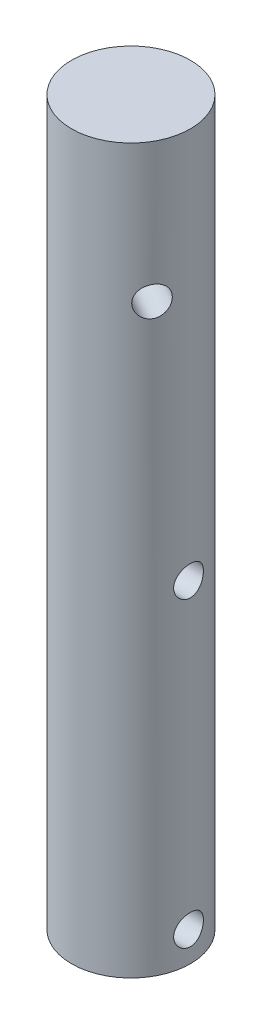
ISO-10303-21;
HEADER;
FILE_DESCRIPTION(('STEP AP214'),'2;1');
FILE_NAME('part.step','',(''),(''),'','','');
FILE_SCHEMA(('AUTOMOTIVE_DESIGN { 1 0 10303 214 1 1 1 1 }'));
ENDSEC;
DATA;
#1=APPLICATION_CONTEXT('core data for automotive mechanical design processes');
#2=APPLICATION_PROTOCOL_DEFINITION('international standard','automotive_design',2000,#1);
#3=PRODUCT_CONTEXT('',#1,'mechanical');
#4=PRODUCT('Part','Part','',(#3));
#5=PRODUCT_RELATED_PRODUCT_CATEGORY('part','',(#4));
#6=PRODUCT_DEFINITION_FORMATION('','',#4);
#7=PRODUCT_DEFINITION_CONTEXT('part definition',#1,'design');
#8=PRODUCT_DEFINITION('design','',#6,#7);
#9=PRODUCT_DEFINITION_SHAPE('','',#8);
#10=(LENGTH_UNIT() NAMED_UNIT(*) SI_UNIT(.MILLI.,.METRE.));
#11=(NAMED_UNIT(*) PLANE_ANGLE_UNIT() SI_UNIT($,.RADIAN.));
#12=(NAMED_UNIT(*) SI_UNIT($,.STERADIAN.) SOLID_ANGLE_UNIT());
#13=UNCERTAINTY_MEASURE_WITH_UNIT(LENGTH_MEASURE(1.E-05),#10,'distance_accuracy_value','');
#14=(GEOMETRIC_REPRESENTATION_CONTEXT(3) GLOBAL_UNCERTAINTY_ASSIGNED_CONTEXT((#13)) GLOBAL_UNIT_ASSIGNED_CONTEXT((#10,
#11,#12)) REPRESENTATION_CONTEXT('',''));
#15=CARTESIAN_POINT('',(0.,0.,0.));
#16=DIRECTION('',(0.,0.,1.));
#17=DIRECTION('',(1.,0.,0.));
#18=AXIS2_PLACEMENT_3D('',#15,#16,#17);
#19=CARTESIAN_POINT('',(-19.0091828831705,210.,-53.2448828787845));
#20=DIRECTION('',(0.,1.,0.));
#21=DIRECTION('',(0.,0.,-1.));
#22=AXIS2_PLACEMENT_3D('',#19,#20,#21);
#23=CYLINDRICAL_SURFACE('',#22,6.);
#24=CARTESIAN_POINT('',(-19.0091828831705,210.,-53.2448828787845));
#25=DIRECTION('',(0.,1.,0.));
#26=DIRECTION('',(0.,0.,1.));
#27=AXIS2_PLACEMENT_3D('',#24,#25,#26);
#28=CIRCLE('',#27,6.);
#29=CARTESIAN_POINT('',(-19.0091828831705,210.,-47.2448828787845));
#30=VERTEX_POINT('',#29);
#31=EDGE_CURVE('E10',#30,#30,#28,.T.);
#32=ORIENTED_EDGE('',*,*,#31,.T.);
#33=EDGE_LOOP('',(#32));
#34=FACE_BOUND('',#33,.T.);
#35=CARTESIAN_POINT('',(-19.0091828831705,283.,-53.2448828787845));
#36=DIRECTION('',(0.,1.,0.));
#37=DIRECTION('',(0.,0.,1.));
#38=AXIS2_PLACEMENT_3D('',#35,#36,#37);
#39=CIRCLE('',#38,6.);
#40=CARTESIAN_POINT('',(-19.0091828831705,283.,-47.2448828787845));
#41=VERTEX_POINT('',#40);
#42=EDGE_CURVE('E51',#41,#41,#39,.T.);
#43=ORIENTED_EDGE('',*,*,#42,.F.);
#44=EDGE_LOOP('',(#43));
#45=FACE_BOUND('',#44,.T.);
#46=CARTESIAN_POINT('',(-24.8186579024817,213.,-51.7448828787845));
#47=CARTESIAN_POINT('',(-24.8186594836824,212.917169549445,-51.7448852316294));
#48=CARTESIAN_POINT('',(-24.820448719254,212.834313060793,-51.7517671314861));
#49=CARTESIAN_POINT('',(-24.82739405513,212.670979453096,-51.779069003506));
#50=CARTESIAN_POINT('',(-24.8325521149014,212.590503747319,-51.7994968547392));
#51=CARTESIAN_POINT('',(-24.8456152307463,212.434317877088,-51.8531881590053));
#52=CARTESIAN_POINT('',(-24.853516739313,212.358601706769,-51.8864350420718));
#53=CARTESIAN_POINT('',(-24.8711720353434,212.213813488476,-51.9647701940276));
#54=CARTESIAN_POINT('',(-24.8809259014415,212.144741722752,-52.0098589656481));
#55=CARTESIAN_POINT('',(-24.9014271813042,212.013683012843,-52.1116578223974));
#56=CARTESIAN_POINT('',(-24.9121904689087,211.95186383979,-52.1685807461621));
#57=CARTESIAN_POINT('',(-24.9333601362623,211.838543163384,-52.2919736403241));
#58=CARTESIAN_POINT('',(-24.9437664825689,211.787042624627,-52.3584445022763));
#59=CARTESIAN_POINT('',(-24.963225376294,211.695134719421,-52.5001957581371));
#60=CARTESIAN_POINT('',(-24.9722570075741,211.654892167103,-52.5755861330674));
#61=CARTESIAN_POINT('',(-24.9877677547264,211.587714213508,-52.7323249682088));
#62=CARTESIAN_POINT('',(-24.9942472471766,211.560776848851,-52.8136725473093));
#63=CARTESIAN_POINT('',(-25.0038114362596,211.521511299253,-52.978267623532));
#64=CARTESIAN_POINT('',(-25.0069622462364,211.508898213404,-53.0614432470551));
#65=CARTESIAN_POINT('',(-25.0097444478143,211.497744972435,-53.2287855872268));
#66=CARTESIAN_POINT('',(-25.0093763597508,211.499202736674,-53.3129521555073));
#67=CARTESIAN_POINT('',(-25.0052114528917,211.51594491015,-53.4779112495431));
#68=CARTESIAN_POINT('',(-25.0014908972158,211.530921795032,-53.5587372021861));
#69=CARTESIAN_POINT('',(-24.9911279023197,211.573782762029,-53.716690249905));
#70=CARTESIAN_POINT('',(-24.9844853075612,211.601667531226,-53.7938171478401));
#71=CARTESIAN_POINT('',(-24.9689079413759,211.669801542412,-53.9429929340372));
#72=CARTESIAN_POINT('',(-24.9599530013409,211.710160226797,-54.0149896434342));
#73=CARTESIAN_POINT('',(-24.9407223060284,211.80201340747,-54.1512963122952));
#74=CARTESIAN_POINT('',(-24.9304463210855,211.853509841136,-54.2156049314127));
#75=CARTESIAN_POINT('',(-24.9093651657877,211.967825245189,-54.3365439314119));
#76=CARTESIAN_POINT('',(-24.898553200326,212.030912935409,-54.3929193973973));
#77=CARTESIAN_POINT('',(-24.8778731442708,212.165759984124,-54.494347442729));
#78=CARTESIAN_POINT('',(-24.8680050978064,212.237519747695,-54.5393994928535));
#79=CARTESIAN_POINT('',(-24.8503058641604,212.388174020489,-54.6170650723184));
#80=CARTESIAN_POINT('',(-24.8424847855249,212.467101438188,-54.6496172292402));
#81=CARTESIAN_POINT('',(-24.8298947240103,212.629551280846,-54.700911309739));
#82=CARTESIAN_POINT('',(-24.8251250880318,212.71307271839,-54.7196561886138));
#83=CARTESIAN_POINT('',(-24.8193150194054,212.879975700914,-54.7423806619836));
#84=CARTESIAN_POINT('',(-24.8181794177324,212.963302675998,-54.7467371631363));
#85=CARTESIAN_POINT('',(-24.8195069440568,213.129493161947,-54.7415930730938));
#86=CARTESIAN_POINT('',(-24.8219697407781,213.212356714771,-54.7320937574938));
#87=CARTESIAN_POINT('',(-24.8301253748979,213.373868558973,-54.6998381571471));
#88=CARTESIAN_POINT('',(-24.8357647045768,213.452563635943,-54.6773013197535));
#89=CARTESIAN_POINT('',(-24.8495871927963,213.605058874711,-54.6198537277868));
#90=CARTESIAN_POINT('',(-24.8577706526622,213.678858455433,-54.584941507412));
#91=CARTESIAN_POINT('',(-24.8759597057301,213.82106476672,-54.5029452795464));
#92=CARTESIAN_POINT('',(-24.8859978948104,213.889337304026,-54.4556359310859));
#93=CARTESIAN_POINT('',(-24.9066853816008,214.017113017681,-54.3504733181862));
#94=CARTESIAN_POINT('',(-24.9173347795414,214.07661474999,-54.2926183209926));
#95=CARTESIAN_POINT('',(-24.9383673013602,214.186686625543,-54.1662769602616));
#96=CARTESIAN_POINT('',(-24.9487370955415,214.236996037529,-54.0975608075819));
#97=CARTESIAN_POINT('',(-24.9677661828529,214.325361520171,-53.9524369028265));
#98=CARTESIAN_POINT('',(-24.9764255651943,214.363418229965,-53.8760295522209));
#99=CARTESIAN_POINT('',(-24.9910035776004,214.425867620717,-53.7182201813811));
#100=CARTESIAN_POINT('',(-24.996941863305,214.450358570627,-53.6368589503263));
#101=CARTESIAN_POINT('',(-25.0054946435453,214.485276200765,-53.4710075192627));
#102=CARTESIAN_POINT('',(-25.008109779531,214.495705595243,-53.3865179263463));
#103=CARTESIAN_POINT('',(-25.0096954243027,214.502051384363,-53.2192575891195));
#104=CARTESIAN_POINT('',(-25.0087625663707,214.498352563643,-53.1365021383354));
#105=CARTESIAN_POINT('',(-25.0035713300319,214.477428259058,-52.9728316341624));
#106=CARTESIAN_POINT('',(-24.999313050527,214.46020317748,-52.8919165261131));
#107=CARTESIAN_POINT('',(-24.98796437598,214.412921670344,-52.7346263253173));
#108=CARTESIAN_POINT('',(-24.9808893507105,214.382934820028,-52.6582291369129));
#109=CARTESIAN_POINT('',(-24.9646522168713,214.311044131471,-52.5115072992223));
#110=CARTESIAN_POINT('',(-24.9554898452366,214.269138790996,-52.4411834168869));
#111=CARTESIAN_POINT('',(-24.9357916283905,214.173427149004,-52.3067799861486));
#112=CARTESIAN_POINT('',(-24.9252281373547,214.119359785639,-52.2428903963336));
#113=CARTESIAN_POINT('',(-24.9040426189692,214.001365722039,-52.1249603483776));
#114=CARTESIAN_POINT('',(-24.8934205774589,213.937436525853,-52.0709223911822));
#115=CARTESIAN_POINT('',(-24.8730950210788,213.800097878698,-51.9732398390656));
#116=CARTESIAN_POINT('',(-24.8634123391188,213.726533814881,-51.9298079496147));
#117=CARTESIAN_POINT('',(-24.8463422164298,213.572916765116,-51.855992533861));
#118=CARTESIAN_POINT('',(-24.8389531068711,213.49286855084,-51.8255995141449));
#119=CARTESIAN_POINT('',(-24.8284615142673,213.34413448226,-51.7832490859363));
#120=CARTESIAN_POINT('',(-24.8248128281787,213.276160253424,-51.7688931228914));
#121=CARTESIAN_POINT('',(-24.8199104619541,213.1387966965,-51.7497094399246));
#122=CARTESIAN_POINT('',(-24.81865657752,213.069407489632,-51.7448809072262));
#123=CARTESIAN_POINT('',(-24.8186579024817,213.,-51.7448828787845));
#124=B_SPLINE_CURVE_WITH_KNOTS('',3,(#46,#47,#48,#49,#50,#51,#52,#53,#54,#55,#56,#57,#58,#59,
#60,#61,#62,#63,#64,#65,#66,#67,#68,#69,#70,#71,#72,#73,#74,#75,#76,#77,#78,#79,#80,#81,#82,#83,
#84,#85,#86,#87,#88,#89,#90,#91,#92,#93,#94,#95,#96,#97,#98,#99,#100,#101,#102,#103,#104,#105,
#106,#107,#108,#109,#110,#111,#112,#113,#114,#115,#116,#117,#118,#119,#120,#121,#122,#123),
.UNSPECIFIED.,.T.,.F.,(4,2,2,2,2,2,2,2,2,2,2,2,2,2,2,2,2,2,2,2,2,2,2,2,2,2,2,2,2,2,2,2,2,2,2,2,
2,2,4),(0.,0.248236465041684,0.496617444857199,0.744678436299644,0.992749960532891,
1.24574372515788,1.49876112887921,1.75530897838753,2.01181895908258,2.26313250597209,
2.51440889199613,2.7601095761337,3.00582334034872,3.25375724552665,3.50173431281347,
3.75642279943147,4.01112318719882,4.26705859205042,4.52293920077729,4.77206144857032,
5.02116076310284,5.26618443005529,5.51123712852856,5.76109707515499,6.01099811331029,
6.26715198579193,6.52329249431732,6.77755243684159,7.03176329345425,7.27910067676476,
7.5264307042619,7.77242925935828,8.01845883442845,8.27038257949245,8.52237018939307,
8.77905886370805,9.03556032819972,9.24358696306398,9.45159585059714),.UNSPECIFIED.);
#125=CARTESIAN_POINT('',(-24.8186579024817,213.,-51.7448828787845));
#126=VERTEX_POINT('',#125);
#127=EDGE_CURVE('E56',#126,#126,#124,.T.);
#128=ORIENTED_EDGE('',*,*,#127,.T.);
#129=EDGE_LOOP('',(#128));
#130=FACE_BOUND('',#129,.T.);
#131=CARTESIAN_POINT('',(-13.1997078638594,213.,-51.7448828787845));
#132=CARTESIAN_POINT('',(-13.1997062826587,213.082830450555,-51.7448852316294));
#133=CARTESIAN_POINT('',(-13.1979170470871,213.165686939207,-51.7517671314861));
#134=CARTESIAN_POINT('',(-13.190971711211,213.329020546904,-51.779069003506));
#135=CARTESIAN_POINT('',(-13.1858136514397,213.409496252681,-51.7994968547392));
#136=CARTESIAN_POINT('',(-13.1727505355947,213.565682122912,-51.8531881590053));
#137=CARTESIAN_POINT('',(-13.1648490270281,213.641398293231,-51.8864350420718));
#138=CARTESIAN_POINT('',(-13.1471937309977,213.786186511524,-51.9647701940276));
#139=CARTESIAN_POINT('',(-13.1374398648995,213.855258277248,-52.0098589656481));
#140=CARTESIAN_POINT('',(-13.1169385850369,213.986316987157,-52.1116578223974));
#141=CARTESIAN_POINT('',(-13.1061752974323,214.04813616021,-52.1685807461621));
#142=CARTESIAN_POINT('',(-13.0850056300787,214.161456836616,-52.2919736403241));
#143=CARTESIAN_POINT('',(-13.0745992837722,214.212957375373,-52.3584445022763));
#144=CARTESIAN_POINT('',(-13.055140390047,214.304865280579,-52.5001957581371));
#145=CARTESIAN_POINT('',(-13.046108758767,214.345107832897,-52.5755861330674));
#146=CARTESIAN_POINT('',(-13.0305980116146,214.412285786492,-52.7323249682088));
#147=CARTESIAN_POINT('',(-13.0241185191645,214.439223151149,-52.8136725473093));
#148=CARTESIAN_POINT('',(-13.0145543300814,214.478488700747,-52.978267623532));
#149=CARTESIAN_POINT('',(-13.0114035201046,214.491101786596,-53.0614432470551));
#150=CARTESIAN_POINT('',(-13.0086213185267,214.502255027565,-53.2287855872268));
#151=CARTESIAN_POINT('',(-13.0089894065903,214.500797263326,-53.3129521555073));
#152=CARTESIAN_POINT('',(-13.0131543134493,214.48405508985,-53.4779112495431));
#153=CARTESIAN_POINT('',(-13.0168748691253,214.469078204968,-53.5587372021861));
#154=CARTESIAN_POINT('',(-13.0272378640214,214.426217237971,-53.716690249905));
#155=CARTESIAN_POINT('',(-13.0338804587799,214.398332468774,-53.7938171478401));
#156=CARTESIAN_POINT('',(-13.0494578249652,214.330198457588,-53.9429929340372));
#157=CARTESIAN_POINT('',(-13.0584127650002,214.289839773203,-54.0149896434342));
#158=CARTESIAN_POINT('',(-13.0776434603126,214.19798659253,-54.1512963122952));
#159=CARTESIAN_POINT('',(-13.0879194452556,214.146490158864,-54.2156049314127));
#160=CARTESIAN_POINT('',(-13.1090006005534,214.032174754811,-54.3365439314119));
#161=CARTESIAN_POINT('',(-13.119812566015,213.969087064591,-54.3929193973973));
#162=CARTESIAN_POINT('',(-13.1404926220703,213.834240015876,-54.494347442729));
#163=CARTESIAN_POINT('',(-13.1503606685347,213.762480252305,-54.5393994928535));
#164=CARTESIAN_POINT('',(-13.1680599021806,213.611825979511,-54.6170650723184));
#165=CARTESIAN_POINT('',(-13.1758809808162,213.532898561812,-54.6496172292402));
#166=CARTESIAN_POINT('',(-13.1884710423308,213.370448719154,-54.700911309739));
#167=CARTESIAN_POINT('',(-13.1932406783092,213.28692728161,-54.7196561886138));
#168=CARTESIAN_POINT('',(-13.1990507469357,213.120024299086,-54.7423806619836));
#169=CARTESIAN_POINT('',(-13.2001863486086,213.036697324002,-54.7467371631363));
#170=CARTESIAN_POINT('',(-13.1988588222843,212.870506838053,-54.7415930730938));
#171=CARTESIAN_POINT('',(-13.1963960255629,212.787643285229,-54.7320937574938));
#172=CARTESIAN_POINT('',(-13.1882403914432,212.626131441027,-54.6998381571471));
#173=CARTESIAN_POINT('',(-13.1826010617643,212.547436364057,-54.6773013197535));
#174=CARTESIAN_POINT('',(-13.1687785735448,212.394941125289,-54.6198537277868));
#175=CARTESIAN_POINT('',(-13.1605951136789,212.321141544567,-54.584941507412));
#176=CARTESIAN_POINT('',(-13.142406060611,212.17893523328,-54.5029452795464));
#177=CARTESIAN_POINT('',(-13.1323678715307,212.110662695974,-54.4556359310859));
#178=CARTESIAN_POINT('',(-13.1116803847402,211.982886982319,-54.3504733181862));
#179=CARTESIAN_POINT('',(-13.1010309867997,211.92338525001,-54.2926183209926));
#180=CARTESIAN_POINT('',(-13.0799984649809,211.813313374457,-54.1662769602616));
#181=CARTESIAN_POINT('',(-13.0696286707995,211.763003962471,-54.0975608075819));
#182=CARTESIAN_POINT('',(-13.0505995834881,211.674638479829,-53.9524369028265));
#183=CARTESIAN_POINT('',(-13.0419402011468,211.636581770035,-53.8760295522209));
#184=CARTESIAN_POINT('',(-13.0273621887406,211.574132379283,-53.7182201813811));
#185=CARTESIAN_POINT('',(-13.0214239030361,211.549641429373,-53.6368589503263));
#186=CARTESIAN_POINT('',(-13.0128711227958,211.514723799235,-53.4710075192627));
#187=CARTESIAN_POINT('',(-13.0102559868101,211.504294404757,-53.3865179263464));
#188=CARTESIAN_POINT('',(-13.0086703420384,211.497948615637,-53.2192575891195));
#189=CARTESIAN_POINT('',(-13.0096031999704,211.501647436357,-53.1365021383354));
#190=CARTESIAN_POINT('',(-13.0147944363092,211.522571740941,-52.9728316341624));
#191=CARTESIAN_POINT('',(-13.0190527158141,211.53979682252,-52.8919165261131));
#192=CARTESIAN_POINT('',(-13.0304013903611,211.587078329656,-52.7346263253173));
#193=CARTESIAN_POINT('',(-13.0374764156305,211.617065179972,-52.6582291369129));
#194=CARTESIAN_POINT('',(-13.0537135494698,211.688955868529,-52.5115072992223));
#195=CARTESIAN_POINT('',(-13.0628759211045,211.730861209004,-52.4411834168869));
#196=CARTESIAN_POINT('',(-13.0825741379505,211.826572850996,-52.3067799861486));
#197=CARTESIAN_POINT('',(-13.0931376289864,211.880640214361,-52.2428903963336));
#198=CARTESIAN_POINT('',(-13.1143231473719,211.998634277961,-52.1249603483776));
#199=CARTESIAN_POINT('',(-13.1249451888822,212.062563474147,-52.0709223911822));
#200=CARTESIAN_POINT('',(-13.1452707452623,212.199902121302,-51.9732398390656));
#201=CARTESIAN_POINT('',(-13.1549534272223,212.273466185119,-51.9298079496146));
#202=CARTESIAN_POINT('',(-13.1720235499113,212.427083234884,-51.855992533861));
#203=CARTESIAN_POINT('',(-13.17941265947,212.50713144916,-51.8255995141449));
#204=CARTESIAN_POINT('',(-13.1899042520738,212.65586551774,-51.7832490859363));
#205=CARTESIAN_POINT('',(-13.1935529381623,212.723839746576,-51.7688931228914));
#206=CARTESIAN_POINT('',(-13.198455304387,212.8612033035,-51.7497094399246));
#207=CARTESIAN_POINT('',(-13.1997091888211,212.930592510368,-51.7448809072262));
#208=CARTESIAN_POINT('',(-13.1997078638594,213.,-51.7448828787845));
#209=B_SPLINE_CURVE_WITH_KNOTS('',3,(#131,#132,#133,#134,#135,#136,#137,#138,#139,#140,#141,
#142,#143,#144,#145,#146,#147,#148,#149,#150,#151,#152,#153,#154,#155,#156,#157,#158,#159,#160,
#161,#162,#163,#164,#165,#166,#167,#168,#169,#170,#171,#172,#173,#174,#175,#176,#177,#178,#179,
#180,#181,#182,#183,#184,#185,#186,#187,#188,#189,#190,#191,#192,#193,#194,#195,#196,#197,#198,
#199,#200,#201,#202,#203,#204,#205,#206,#207,#208),.UNSPECIFIED.,.T.,.F.,(4,2,2,2,2,2,2,2,2,2,2,
2,2,2,2,2,2,2,2,2,2,2,2,2,2,2,2,2,2,2,2,2,2,2,2,2,2,2,4),(0.,0.248236465041684,
0.496617444857199,0.744678436299612,0.992749960532891,1.24574372515788,1.49876112887921,
1.75530897838754,2.01181895908258,2.26313250597209,2.51440889199613,2.7601095761337,
3.00582334034872,3.25375724552665,3.50173431281347,3.75642279943146,4.01112318719882,
4.26705859205042,4.52293920077729,4.77206144857032,5.02116076310284,5.26618443005528,
5.51123712852855,5.76109707515498,6.01099811331029,6.26715198579192,6.52329249431732,
6.77755243684156,7.03176329345424,7.27910067676475,7.5264307042619,7.77242925935828,
8.01845883442845,8.27038257949244,8.52237018939307,8.77905886370809,9.03556032819972,
9.24358696306398,9.45159585059714),.UNSPECIFIED.);
#210=CARTESIAN_POINT('',(-13.1997078638594,213.,-51.7448828787845));
#211=VERTEX_POINT('',#210);
#212=EDGE_CURVE('E57',#211,#211,#209,.T.);
#213=ORIENTED_EDGE('',*,*,#212,.T.);
#214=EDGE_LOOP('',(#213));
#215=FACE_BOUND('',#214,.T.);
#216=CARTESIAN_POINT('',(-24.8186579024817,243.5,-51.7448828787845));
#217=CARTESIAN_POINT('',(-24.8186594836824,243.417169549445,-51.7448852316294));
#218=CARTESIAN_POINT('',(-24.820448719254,243.334313060793,-51.7517671314861));
#219=CARTESIAN_POINT('',(-24.82739405513,243.170979453096,-51.779069003506));
#220=CARTESIAN_POINT('',(-24.8325521149014,243.090503747319,-51.7994968547392));
#221=CARTESIAN_POINT('',(-24.8456152307463,242.934317877088,-51.8531881590053));
#222=CARTESIAN_POINT('',(-24.853516739313,242.858601706769,-51.8864350420718));
#223=CARTESIAN_POINT('',(-24.8711720353434,242.713813488476,-51.9647701940276));
#224=CARTESIAN_POINT('',(-24.8809259014415,242.644741722752,-52.0098589656481));
#225=CARTESIAN_POINT('',(-24.9014271813042,242.513683012843,-52.1116578223974));
#226=CARTESIAN_POINT('',(-24.9121904689087,242.45186383979,-52.1685807461621));
#227=CARTESIAN_POINT('',(-24.9333601362623,242.338543163384,-52.2919736403241));
#228=CARTESIAN_POINT('',(-24.9437664825689,242.287042624627,-52.3584445022763));
#229=CARTESIAN_POINT('',(-24.963225376294,242.195134719421,-52.5001957581371));
#230=CARTESIAN_POINT('',(-24.9722570075741,242.154892167103,-52.5755861330674));
#231=CARTESIAN_POINT('',(-24.9877677547264,242.087714213508,-52.7323249682088));
#232=CARTESIAN_POINT('',(-24.9942472471766,242.060776848851,-52.8136725473093));
#233=CARTESIAN_POINT('',(-25.0038114362596,242.021511299253,-52.978267623532));
#234=CARTESIAN_POINT('',(-25.0069622462364,242.008898213404,-53.0614432470551));
#235=CARTESIAN_POINT('',(-25.0097444478143,241.997744972435,-53.2287855872268));
#236=CARTESIAN_POINT('',(-25.0093763597508,241.999202736674,-53.3129521555073));
#237=CARTESIAN_POINT('',(-25.0052114528917,242.01594491015,-53.4779112495431));
#238=CARTESIAN_POINT('',(-25.0014908972158,242.030921795032,-53.5587372021861));
#239=CARTESIAN_POINT('',(-24.9911279023197,242.073782762029,-53.716690249905));
#240=CARTESIAN_POINT('',(-24.9844853075612,242.101667531226,-53.7938171478401));
#241=CARTESIAN_POINT('',(-24.9689079413759,242.169801542412,-53.9429929340372));
#242=CARTESIAN_POINT('',(-24.9599530013408,242.210160226797,-54.0149896434342));
#243=CARTESIAN_POINT('',(-24.9407223060284,242.30201340747,-54.1512963122952));
#244=CARTESIAN_POINT('',(-24.9304463210855,242.353509841136,-54.2156049314127));
#245=CARTESIAN_POINT('',(-24.9093651657877,242.467825245189,-54.3365439314119));
#246=CARTESIAN_POINT('',(-24.898553200326,242.530912935409,-54.3929193973973));
#247=CARTESIAN_POINT('',(-24.8778731442708,242.665759984124,-54.494347442729));
#248=CARTESIAN_POINT('',(-24.8680050978064,242.737519747695,-54.5393994928535));
#249=CARTESIAN_POINT('',(-24.8503058641604,242.888174020489,-54.6170650723184));
#250=CARTESIAN_POINT('',(-24.8424847855249,242.967101438188,-54.6496172292402));
#251=CARTESIAN_POINT('',(-24.8298947240103,243.129551280846,-54.700911309739));
#252=CARTESIAN_POINT('',(-24.8251250880318,243.21307271839,-54.7196561886138));
#253=CARTESIAN_POINT('',(-24.8193150194054,243.379975700914,-54.7423806619836));
#254=CARTESIAN_POINT('',(-24.8181794177324,243.463302675998,-54.7467371631363));
#255=CARTESIAN_POINT('',(-24.8195069440568,243.629493161947,-54.7415930730938));
#256=CARTESIAN_POINT('',(-24.8219697407781,243.712356714771,-54.7320937574938));
#257=CARTESIAN_POINT('',(-24.8301253748979,243.873868558973,-54.6998381571471));
#258=CARTESIAN_POINT('',(-24.8357647045768,243.952563635943,-54.6773013197535));
#259=CARTESIAN_POINT('',(-24.8495871927963,244.105058874711,-54.6198537277868));
#260=CARTESIAN_POINT('',(-24.8577706526622,244.178858455433,-54.584941507412));
#261=CARTESIAN_POINT('',(-24.8759597057301,244.32106476672,-54.5029452795464));
#262=CARTESIAN_POINT('',(-24.8859978948104,244.389337304026,-54.4556359310858));
#263=CARTESIAN_POINT('',(-24.9066853816008,244.517113017681,-54.3504733181862));
#264=CARTESIAN_POINT('',(-24.9173347795414,244.57661474999,-54.2926183209926));
#265=CARTESIAN_POINT('',(-24.9383673013602,244.686686625543,-54.1662769602616));
#266=CARTESIAN_POINT('',(-24.9487370955415,244.736996037529,-54.0975608075819));
#267=CARTESIAN_POINT('',(-24.9677661828529,244.825361520171,-53.9524369028265));
#268=CARTESIAN_POINT('',(-24.9764255651943,244.863418229965,-53.8760295522209));
#269=CARTESIAN_POINT('',(-24.9910035776004,244.925867620717,-53.7182201813811));
#270=CARTESIAN_POINT('',(-24.996941863305,244.950358570627,-53.6368589503263));
#271=CARTESIAN_POINT('',(-25.0054946435453,244.985276200765,-53.4710075192627));
#272=CARTESIAN_POINT('',(-25.008109779531,244.995705595243,-53.3865179263463));
#273=CARTESIAN_POINT('',(-25.0096954243027,245.002051384363,-53.2192575891195));
#274=CARTESIAN_POINT('',(-25.0087625663707,244.998352563643,-53.1365021383354));
#275=CARTESIAN_POINT('',(-25.0035713300319,244.977428259058,-52.9728316341624));
#276=CARTESIAN_POINT('',(-24.999313050527,244.96020317748,-52.8919165261131));
#277=CARTESIAN_POINT('',(-24.98796437598,244.912921670344,-52.7346263253173));
#278=CARTESIAN_POINT('',(-24.9808893507105,244.882934820028,-52.658229136913));
#279=CARTESIAN_POINT('',(-24.9646522168713,244.811044131471,-52.5115072992223));
#280=CARTESIAN_POINT('',(-24.9554898452366,244.769138790996,-52.4411834168869));
#281=CARTESIAN_POINT('',(-24.9357916283905,244.673427149004,-52.3067799861486));
#282=CARTESIAN_POINT('',(-24.9252281373547,244.619359785639,-52.2428903963336));
#283=CARTESIAN_POINT('',(-24.9040426189692,244.501365722039,-52.1249603483776));
#284=CARTESIAN_POINT('',(-24.8934205774589,244.437436525853,-52.0709223911822));
#285=CARTESIAN_POINT('',(-24.8730950210788,244.300097878698,-51.9732398390656));
#286=CARTESIAN_POINT('',(-24.8634123391188,244.226533814881,-51.9298079496147));
#287=CARTESIAN_POINT('',(-24.8463422164298,244.072916765116,-51.855992533861));
#288=CARTESIAN_POINT('',(-24.8389531068711,243.99286855084,-51.8255995141449));
#289=CARTESIAN_POINT('',(-24.8284615142673,243.84413448226,-51.7832490859363));
#290=CARTESIAN_POINT('',(-24.8248128281787,243.776160253424,-51.7688931228914));
#291=CARTESIAN_POINT('',(-24.8199104619541,243.6387966965,-51.7497094399246));
#292=CARTESIAN_POINT('',(-24.81865657752,243.569407489632,-51.7448809072262));
#293=CARTESIAN_POINT('',(-24.8186579024817,243.5,-51.7448828787845));
#294=B_SPLINE_CURVE_WITH_KNOTS('',3,(#216,#217,#218,#219,#220,#221,#222,#223,#224,#225,#226,
#227,#228,#229,#230,#231,#232,#233,#234,#235,#236,#237,#238,#239,#240,#241,#242,#243,#244,#245,
#246,#247,#248,#249,#250,#251,#252,#253,#254,#255,#256,#257,#258,#259,#260,#261,#262,#263,#264,
#265,#266,#267,#268,#269,#270,#271,#272,#273,#274,#275,#276,#277,#278,#279,#280,#281,#282,#283,
#284,#285,#286,#287,#288,#289,#290,#291,#292,#293),.UNSPECIFIED.,.T.,.F.,(4,2,2,2,2,2,2,2,2,2,2,
2,2,2,2,2,2,2,2,2,2,2,2,2,2,2,2,2,2,2,2,2,2,2,2,2,2,2,4),(0.,0.248236465041684,
0.496617444857199,0.744678436299613,0.992749960532891,1.24574372515788,1.49876112887921,
1.75530897838753,2.01181895908258,2.26313250597209,2.51440889199613,2.7601095761337,
3.00582334034872,3.25375724552668,3.50173431281347,3.75642279943146,4.01112318719882,
4.26705859205042,4.52293920077729,4.77206144857032,5.02116076310284,5.26618443005528,
5.51123712852855,5.76109707515498,6.01099811331029,6.26715198579195,6.52329249431732,
6.77755243684159,7.03176329345425,7.27910067676476,7.5264307042619,7.77242925935827,
8.01845883442845,8.27038257949242,8.52237018939307,8.77905886370802,9.03556032819972,
9.24358696306398,9.45159585059715),.UNSPECIFIED.);
#295=CARTESIAN_POINT('',(-24.8186579024817,243.5,-51.7448828787845));
#296=VERTEX_POINT('',#295);
#297=EDGE_CURVE('E105',#296,#296,#294,.T.);
#298=ORIENTED_EDGE('',*,*,#297,.T.);
#299=EDGE_LOOP('',(#298));
#300=FACE_BOUND('',#299,.T.);
#301=CARTESIAN_POINT('',(-13.1997078638594,243.5,-51.7448828787845));
#302=CARTESIAN_POINT('',(-13.1997062826587,243.582830450555,-51.7448852316294));
#303=CARTESIAN_POINT('',(-13.1979170470871,243.665686939207,-51.7517671314861));
#304=CARTESIAN_POINT('',(-13.190971711211,243.829020546904,-51.779069003506));
#305=CARTESIAN_POINT('',(-13.1858136514397,243.909496252681,-51.7994968547392));
#306=CARTESIAN_POINT('',(-13.1727505355947,244.065682122912,-51.8531881590053));
#307=CARTESIAN_POINT('',(-13.1648490270281,244.141398293231,-51.8864350420718));
#308=CARTESIAN_POINT('',(-13.1471937309977,244.286186511524,-51.9647701940276));
#309=CARTESIAN_POINT('',(-13.1374398648995,244.355258277248,-52.0098589656481));
#310=CARTESIAN_POINT('',(-13.1169385850369,244.486316987157,-52.1116578223974));
#311=CARTESIAN_POINT('',(-13.1061752974323,244.54813616021,-52.1685807461621));
#312=CARTESIAN_POINT('',(-13.0850056300787,244.661456836616,-52.2919736403241));
#313=CARTESIAN_POINT('',(-13.0745992837722,244.712957375373,-52.3584445022763));
#314=CARTESIAN_POINT('',(-13.055140390047,244.804865280579,-52.5001957581371));
#315=CARTESIAN_POINT('',(-13.046108758767,244.845107832897,-52.5755861330674));
#316=CARTESIAN_POINT('',(-13.0305980116146,244.912285786492,-52.7323249682088));
#317=CARTESIAN_POINT('',(-13.0241185191645,244.939223151149,-52.8136725473093));
#318=CARTESIAN_POINT('',(-13.0145543300814,244.978488700747,-52.978267623532));
#319=CARTESIAN_POINT('',(-13.0114035201046,244.991101786596,-53.0614432470551));
#320=CARTESIAN_POINT('',(-13.0086213185267,245.002255027565,-53.2287855872268));
#321=CARTESIAN_POINT('',(-13.0089894065903,245.000797263326,-53.3129521555073));
#322=CARTESIAN_POINT('',(-13.0131543134493,244.98405508985,-53.4779112495431));
#323=CARTESIAN_POINT('',(-13.0168748691253,244.969078204968,-53.5587372021861));
#324=CARTESIAN_POINT('',(-13.0272378640214,244.926217237971,-53.716690249905));
#325=CARTESIAN_POINT('',(-13.0338804587799,244.898332468774,-53.7938171478401));
#326=CARTESIAN_POINT('',(-13.0494578249652,244.830198457588,-53.9429929340372));
#327=CARTESIAN_POINT('',(-13.0584127650002,244.789839773203,-54.0149896434342));
#328=CARTESIAN_POINT('',(-13.0776434603126,244.69798659253,-54.1512963122952));
#329=CARTESIAN_POINT('',(-13.0879194452556,244.646490158864,-54.2156049314127));
#330=CARTESIAN_POINT('',(-13.1090006005534,244.532174754811,-54.3365439314119));
#331=CARTESIAN_POINT('',(-13.119812566015,244.469087064591,-54.3929193973973));
#332=CARTESIAN_POINT('',(-13.1404926220703,244.334240015876,-54.494347442729));
#333=CARTESIAN_POINT('',(-13.1503606685347,244.262480252305,-54.5393994928535));
#334=CARTESIAN_POINT('',(-13.1680599021806,244.111825979511,-54.6170650723184));
#335=CARTESIAN_POINT('',(-13.1758809808162,244.032898561812,-54.6496172292402));
#336=CARTESIAN_POINT('',(-13.1884710423308,243.870448719154,-54.700911309739));
#337=CARTESIAN_POINT('',(-13.1932406783092,243.78692728161,-54.7196561886138));
#338=CARTESIAN_POINT('',(-13.1990507469357,243.620024299086,-54.7423806619836));
#339=CARTESIAN_POINT('',(-13.2001863486086,243.536697324002,-54.7467371631363));
#340=CARTESIAN_POINT('',(-13.1988588222843,243.370506838053,-54.7415930730938));
#341=CARTESIAN_POINT('',(-13.1963960255629,243.287643285229,-54.7320937574938));
#342=CARTESIAN_POINT('',(-13.1882403914432,243.126131441027,-54.6998381571471));
#343=CARTESIAN_POINT('',(-13.1826010617643,243.047436364057,-54.6773013197535));
#344=CARTESIAN_POINT('',(-13.1687785735448,242.894941125289,-54.6198537277868));
#345=CARTESIAN_POINT('',(-13.1605951136789,242.821141544567,-54.584941507412));
#346=CARTESIAN_POINT('',(-13.142406060611,242.67893523328,-54.5029452795464));
#347=CARTESIAN_POINT('',(-13.1323678715307,242.610662695974,-54.4556359310859));
#348=CARTESIAN_POINT('',(-13.1116803847402,242.482886982319,-54.3504733181862));
#349=CARTESIAN_POINT('',(-13.1010309867997,242.42338525001,-54.2926183209926));
#350=CARTESIAN_POINT('',(-13.0799984649809,242.313313374457,-54.1662769602616));
#351=CARTESIAN_POINT('',(-13.0696286707995,242.263003962471,-54.0975608075819));
#352=CARTESIAN_POINT('',(-13.0505995834881,242.174638479829,-53.9524369028265));
#353=CARTESIAN_POINT('',(-13.0419402011468,242.136581770035,-53.8760295522209));
#354=CARTESIAN_POINT('',(-13.0273621887406,242.074132379283,-53.7182201813811));
#355=CARTESIAN_POINT('',(-13.0214239030361,242.049641429373,-53.6368589503263));
#356=CARTESIAN_POINT('',(-13.0128711227958,242.014723799235,-53.4710075192627));
#357=CARTESIAN_POINT('',(-13.0102559868101,242.004294404757,-53.3865179263464));
#358=CARTESIAN_POINT('',(-13.0086703420384,241.997948615637,-53.2192575891195));
#359=CARTESIAN_POINT('',(-13.0096031999704,242.001647436357,-53.1365021383354));
#360=CARTESIAN_POINT('',(-13.0147944363092,242.022571740941,-52.9728316341624));
#361=CARTESIAN_POINT('',(-13.0190527158141,242.03979682252,-52.8919165261131));
#362=CARTESIAN_POINT('',(-13.0304013903611,242.087078329656,-52.7346263253173));
#363=CARTESIAN_POINT('',(-13.0374764156305,242.117065179972,-52.6582291369129));
#364=CARTESIAN_POINT('',(-13.0537135494698,242.188955868529,-52.5115072992223));
#365=CARTESIAN_POINT('',(-13.0628759211045,242.230861209004,-52.4411834168869));
#366=CARTESIAN_POINT('',(-13.0825741379505,242.326572850996,-52.3067799861486));
#367=CARTESIAN_POINT('',(-13.0931376289864,242.380640214361,-52.2428903963336));
#368=CARTESIAN_POINT('',(-13.1143231473719,242.498634277961,-52.1249603483776));
#369=CARTESIAN_POINT('',(-13.1249451888822,242.562563474147,-52.0709223911822));
#370=CARTESIAN_POINT('',(-13.1452707452623,242.699902121302,-51.9732398390656));
#371=CARTESIAN_POINT('',(-13.1549534272223,242.773466185119,-51.9298079496146));
#372=CARTESIAN_POINT('',(-13.1720235499113,242.927083234884,-51.855992533861));
#373=CARTESIAN_POINT('',(-13.17941265947,243.00713144916,-51.8255995141449));
#374=CARTESIAN_POINT('',(-13.1899042520738,243.15586551774,-51.7832490859363));
#375=CARTESIAN_POINT('',(-13.1935529381623,243.223839746576,-51.7688931228914));
#376=CARTESIAN_POINT('',(-13.198455304387,243.3612033035,-51.7497094399246));
#377=CARTESIAN_POINT('',(-13.1997091888211,243.430592510368,-51.7448809072262));
#378=CARTESIAN_POINT('',(-13.1997078638594,243.5,-51.7448828787845));
#379=B_SPLINE_CURVE_WITH_KNOTS('',3,(#301,#302,#303,#304,#305,#306,#307,#308,#309,#310,#311,
#312,#313,#314,#315,#316,#317,#318,#319,#320,#321,#322,#323,#324,#325,#326,#327,#328,#329,#330,
#331,#332,#333,#334,#335,#336,#337,#338,#339,#340,#341,#342,#343,#344,#345,#346,#347,#348,#349,
#350,#351,#352,#353,#354,#355,#356,#357,#358,#359,#360,#361,#362,#363,#364,#365,#366,#367,#368,
#369,#370,#371,#372,#373,#374,#375,#376,#377,#378),.UNSPECIFIED.,.T.,.F.,(4,2,2,2,2,2,2,2,2,2,2,
2,2,2,2,2,2,2,2,2,2,2,2,2,2,2,2,2,2,2,2,2,2,2,2,2,2,2,4),(0.,0.248236465041684,
0.496617444857199,0.744678436299643,0.992749960532891,1.24574372515788,1.49876112887921,
1.75530897838753,2.01181895908258,2.26313250597209,2.51440889199613,2.7601095761337,
3.00582334034872,3.25375724552668,3.50173431281347,3.75642279943146,4.01112318719882,
4.26705859205042,4.52293920077729,4.77206144857032,5.02116076310284,5.26618443005528,
5.51123712852855,5.76109707515495,6.01099811331029,6.26715198579195,6.52329249431733,
6.77755243684157,7.03176329345425,7.27910067676476,7.5264307042619,7.77242925935828,
8.01845883442845,8.27038257949245,8.52237018939307,8.77905886370812,9.03556032819972,
9.24358696306398,9.45159585059715),.UNSPECIFIED.);
#380=CARTESIAN_POINT('',(-13.1997078638594,243.5,-51.7448828787845));
#381=VERTEX_POINT('',#380);
#382=EDGE_CURVE('E66',#381,#381,#379,.T.);
#383=ORIENTED_EDGE('',*,*,#382,.T.);
#384=EDGE_LOOP('',(#383));
#385=FACE_BOUND('',#384,.T.);
#386=CARTESIAN_POINT('',(-24.7903358325451,269.,-54.8505822827634));
#387=CARTESIAN_POINT('',(-24.7903360254826,268.917169549445,-54.8505851109872));
#388=CARTESIAN_POINT('',(-24.7884445990126,268.834313060793,-54.8574396288752));
#389=CARTESIAN_POINT('',(-24.7808085003091,268.670979453096,-54.8845564115534));
#390=CARTESIAN_POINT('',(-24.7750615854888,268.590503747319,-54.9048264795517));
#391=CARTESIAN_POINT('',(-24.75952892353,268.434317877088,-54.957856070931));
#392=CARTESIAN_POINT('',(-24.7497483891437,268.358601706769,-54.9905994705465));
#393=CARTESIAN_POINT('',(-24.7258707480394,268.213813488476,-55.0672673501648));
#394=CARTESIAN_POINT('',(-24.7117734580554,268.144741722752,-55.1111923048626));
#395=CARTESIAN_POINT('',(-24.6786286588519,268.013683012843,-55.209603340815));
#396=CARTESIAN_POINT('',(-24.6594884774633,267.95186383979,-55.2642816826552));
#397=CARTESIAN_POINT('',(-24.6161255001001,267.838543163384,-55.3817278973228));
#398=CARTESIAN_POINT('',(-24.5919022293861,267.787042624627,-55.4444965255382));
#399=CARTESIAN_POINT('',(-24.5378784977512,267.695134719421,-55.5769861609946));
#400=CARTESIAN_POINT('',(-24.5080049324122,267.654892167103,-55.6467919565251));
#401=CARTESIAN_POINT('',(-24.4430682159071,267.587714213508,-55.7902871430933));
#402=CARTESIAN_POINT('',(-24.4080058314223,267.560776848851,-55.8639759593557));
#403=CARTESIAN_POINT('',(-24.3339911240235,267.521511299253,-56.0113015712439));
#404=CARTESIAN_POINT('',(-24.2951319937443,267.508898213404,-56.0849091791789));
#405=CARTESIAN_POINT('',(-24.2138702809034,267.497744972435,-56.2312229976854));
#406=CARTESIAN_POINT('',(-24.1714682231492,267.499202736674,-56.3039293399338));
#407=CARTESIAN_POINT('',(-24.0853817609871,267.51594491015,-56.4447056525246));
#408=CARTESIAN_POINT('',(-24.041746688934,267.530921795032,-56.5128427029605));
#409=CARTESIAN_POINT('',(-23.9537955482352,267.573782762029,-56.6444525574422));
#410=CARTESIAN_POINT('',(-23.9094794434597,267.601667531226,-56.7079251129899));
#411=CARTESIAN_POINT('',(-23.8214011555207,267.669801542412,-56.8293264503734));
#412=CARTESIAN_POINT('',(-23.7776475952625,267.710160226797,-56.8871999596826));
#413=CARTESIAN_POINT('',(-23.692839990159,267.80201340747,-56.9956296499652));
#414=CARTESIAN_POINT('',(-23.6517864165907,267.853509841136,-57.0461845553318));
#415=CARTESIAN_POINT('',(-23.5730601005621,267.96782524519,-57.1403802239905));
#416=CARTESIAN_POINT('',(-23.5355089308148,268.030912935409,-57.1837968269532));
#417=CARTESIAN_POINT('',(-23.4668854542534,268.165759984124,-57.261296062839));
#418=CARTESIAN_POINT('',(-23.4358134502672,268.237519747695,-57.2953782595072));
#419=CARTESIAN_POINT('',(-23.3816526745699,268.388174020489,-57.3537890075004));
#420=CARTESIAN_POINT('',(-23.3586033433256,268.467101438188,-57.3780694630249));
#421=CARTESIAN_POINT('',(-23.3220529899694,268.629551280846,-57.4161964090434));
#422=CARTESIAN_POINT('',(-23.3085499246078,268.71307271839,-57.4300451323506));
#423=CARTESIAN_POINT('',(-23.2921560208947,268.879975700914,-57.4468200692632));
#424=CARTESIAN_POINT('',(-23.288994310421,268.963302675998,-57.4500251090966));
#425=CARTESIAN_POINT('',(-23.2927160269633,269.129493161947,-57.4462339596026));
#426=CARTESIAN_POINT('',(-23.2995985292884,269.212356714771,-57.4392387093351));
#427=CARTESIAN_POINT('',(-23.3227893157934,269.373868558973,-57.4153823570804));
#428=CARTESIAN_POINT('',(-23.3389415372524,269.452563635943,-57.3986845482161));
#429=CARTESIAN_POINT('',(-23.3796359591774,269.605058874711,-57.3558447182965));
#430=CARTESIAN_POINT('',(-23.4041791534995,269.678858455433,-57.3297015784823));
#431=CARTESIAN_POINT('',(-23.4609294494599,269.82106476672,-57.2677852886701));
#432=CARTESIAN_POINT('',(-23.4932774504417,269.889337304026,-57.2318332856069));
#433=CARTESIAN_POINT('',(-23.5637746459925,270.017113017681,-57.1511035347026));
#434=CARTESIAN_POINT('',(-23.6019247937408,270.07661474999,-57.1063243363674));
#435=CARTESIAN_POINT('',(-23.6833101723071,270.186686625543,-57.007425769335));
#436=CARTESIAN_POINT('',(-23.7266487538401,270.236996037529,-56.9531007325548));
#437=CARTESIAN_POINT('',(-23.8156903792402,270.325361520171,-56.8369342879959));
#438=CARTESIAN_POINT('',(-23.8613932996317,270.363418229965,-56.7750932725063));
#439=CARTESIAN_POINT('',(-23.952922914132,270.425867620717,-56.6457153546069));
#440=CARTESIAN_POINT('',(-23.9987462359345,270.450358570627,-56.5782236044825));
#441=CARTESIAN_POINT('',(-24.0890788764273,270.485276200765,-56.4388684420476));
#442=CARTESIAN_POINT('',(-24.1335884470835,270.495705595244,-56.3670058762195));
#443=CARTESIAN_POINT('',(-24.2185918243506,270.502051384363,-56.2229469975213));
#444=CARTESIAN_POINT('',(-24.2591616710754,270.498352563643,-56.1508122458747));
#445=CARTESIAN_POINT('',(-24.3365011806155,270.477428259059,-56.0064738132412));
#446=CARTESIAN_POINT('',(-24.3732709564124,270.46020317748,-55.9342701343681));
#447=CARTESIAN_POINT('',(-24.4420878163534,270.412921670344,-55.792378487439));
#448=CARTESIAN_POINT('',(-24.4741592589398,270.382934820028,-55.7226790688685));
#449=CARTESIAN_POINT('',(-24.5334584073957,270.311044131471,-55.5874956632188));
#450=CARTESIAN_POINT('',(-24.5606855019688,270.269138790996,-55.5220122088063));
#451=CARTESIAN_POINT('',(-24.61082806114,270.173427149004,-55.3957663150081));
#452=CARTESIAN_POINT('',(-24.6336246044578,270.119359785639,-55.3351545616731));
#453=CARTESIAN_POINT('',(-24.6742424313216,270.001365722039,-55.2224313850809));
#454=CARTESIAN_POINT('',(-24.6920624521313,269.937436525853,-55.1703221206259));
#455=CARTESIAN_POINT('',(-24.7233012800184,269.800097878698,-55.0755637707964));
#456=CARTESIAN_POINT('',(-24.7366317761898,269.726533814881,-55.0331093102175));
#457=CARTESIAN_POINT('',(-24.7587563241722,269.572916765116,-54.9606482236394));
#458=CARTESIAN_POINT('',(-24.7675536774411,269.49286855084,-54.9306325416882));
#459=CARTESIAN_POINT('',(-24.7796429058243,269.34413448226,-54.8887101986966));
#460=CARTESIAN_POINT('',(-24.7836610325037,269.276160253424,-54.8744532269596));
#461=CARTESIAN_POINT('',(-24.7890073002979,269.1387966965,-54.8553884870599));
#462=CARTESIAN_POINT('',(-24.7903356708737,269.069407489632,-54.850579912863));
#463=CARTESIAN_POINT('',(-24.7903358325451,269.,-54.8505822827634));
#464=B_SPLINE_CURVE_WITH_KNOTS('',3,(#386,#387,#388,#389,#390,#391,#392,#393,#394,#395,#396,
#397,#398,#399,#400,#401,#402,#403,#404,#405,#406,#407,#408,#409,#410,#411,#412,#413,#414,#415,
#416,#417,#418,#419,#420,#421,#422,#423,#424,#425,#426,#427,#428,#429,#430,#431,#432,#433,#434,
#435,#436,#437,#438,#439,#440,#441,#442,#443,#444,#445,#446,#447,#448,#449,#450,#451,#452,#453,
#454,#455,#456,#457,#458,#459,#460,#461,#462,#463),.UNSPECIFIED.,.T.,.F.,(4,2,2,2,2,2,2,2,2,2,2,
2,2,2,2,2,2,2,2,2,2,2,2,2,2,2,2,2,2,2,2,2,2,2,2,2,2,2,4),(0.,0.248236465041684,
0.496617444857229,0.744678436299614,0.992749960532861,1.24574372515783,1.49876112887925,
1.75530897838754,2.01181895908257,2.2631325059721,2.51440889199615,2.76010957613371,
3.00582334034873,3.25375724552671,3.50173431281352,3.75642279943155,4.0111231871988,
4.26705859205042,4.5229392007773,4.77206144857032,5.02116076310282,5.26618443005523,
5.51123712852848,5.76109707515497,6.01099811331032,6.26715198579197,6.52329249431732,
6.77755243684158,7.03176329345422,7.27910067676474,7.52643070426191,7.7724292593583,
8.01845883442846,8.27038257949244,8.52237018939304,8.77905886370808,9.03556032819973,
9.24358696306397,9.45159585059707),.UNSPECIFIED.);
#465=CARTESIAN_POINT('',(-24.7903358325451,269.,-54.8505822827634));
#466=VERTEX_POINT('',#465);
#467=EDGE_CURVE('E108',#466,#466,#464,.T.);
#468=ORIENTED_EDGE('',*,*,#467,.T.);
#469=EDGE_LOOP('',(#468));
#470=FACE_BOUND('',#469,.T.);
#471=CARTESIAN_POINT('',(-14.728029933796,269.,-49.0411072634523));
#472=CARTESIAN_POINT('',(-14.7280273880135,269.082830450555,-49.0411085104754));
#473=CARTESIAN_POINT('',(-14.7230369146268,269.165686939207,-49.0461737927918));
#474=CARTESIAN_POINT('',(-14.7033711413104,269.329020546904,-49.0663452395939));
#475=CARTESIAN_POINT('',(-14.6886902048976,269.409496252681,-49.0814572478208));
#476=CARTESIAN_POINT('',(-14.6505315625902,269.565682122912,-49.1214237233552));
#477=CARTESIAN_POINT('',(-14.62706521391,269.641398293231,-49.1462656144041));
#478=CARTESIAN_POINT('',(-14.5726077030585,269.786186511524,-49.2052781979919));
#479=CARTESIAN_POINT('',(-14.5416162214221,269.855258277248,-49.2394492865916));
#480=CARTESIAN_POINT('',(-14.4729621638763,269.986316987157,-49.3173590426813));
#481=CARTESIAN_POINT('',(-14.4351794215002,270.04813616021,-49.361274096917));
#482=CARTESIAN_POINT('',(-14.3551495047013,270.161456836616,-49.457550644231));
#483=CARTESIAN_POINT('',(-14.3129019134631,270.212957375373,-49.5099129261398));
#484=CARTESIAN_POINT('',(-14.2251743892372,270.304865280579,-49.6229436678711));
#485=CARTESIAN_POINT('',(-14.1796575796459,270.345107832897,-49.6837178321215));
#486=CARTESIAN_POINT('',(-14.0878554610096,270.412285786492,-49.8117022715374));
#487=CARTESIAN_POINT('',(-14.0415702663939,270.439223151149,-49.8789115953497));
#488=CARTESIAN_POINT('',(-13.9509898975701,270.478488700747,-50.0166730181548));
#489=CARTESIAN_POINT('',(-13.9066734043261,270.491101786596,-50.0871298161131));
#490=CARTESIAN_POINT('',(-13.8205927769953,270.502255027565,-50.2306614330416));
#491=CARTESIAN_POINT('',(-13.7788282664689,270.500797263326,-50.3037358633536));
#492=CARTESIAN_POINT('',(-13.6999556345954,270.48405508985,-50.4486770828033));
#493=CARTESIAN_POINT('',(-13.6627647540055,270.469078204968,-50.5205346889153));
#494=CARTESIAN_POINT('',(-13.5927628469853,270.426217237971,-50.6625075382931));
#495=CARTESIAN_POINT('',(-13.5599520538256,270.398332468774,-50.7326226885992));
#496=CARTESIAN_POINT('',(-13.4988545555676,270.330198457588,-50.8696013921681));
#497=CARTESIAN_POINT('',(-13.4706114064288,270.289839773203,-50.9364298415123));
#498=CARTESIAN_POINT('',(-13.4191123426713,270.19798659253,-51.0640902271073));
#499=CARTESIAN_POINT('',(-13.3958572971221,270.146490158864,-51.1249211174169));
#500=CARTESIAN_POINT('',(-13.3536446131515,270.032174754811,-51.2401979413734));
#501=CARTESIAN_POINT('',(-13.3348203169134,269.969087064591,-51.2944265097977));
#502=CARTESIAN_POINT('',(-13.3020157481431,269.834240015876,-51.3926058017388));
#503=CARTESIAN_POINT('',(-13.2880357020048,269.762480252305,-51.4365560448714));
#504=CARTESIAN_POINT('',(-13.2645308982372,269.611825979511,-51.5126660265106));
#505=CARTESIAN_POINT('',(-13.2550280725597,269.532898561812,-51.5447675606706));
#506=CARTESIAN_POINT('',(-13.2402843454172,269.370448719154,-51.5954845682036));
#507=CARTESIAN_POINT('',(-13.2350425319039,269.28692728161,-51.6141029274893));
#508=CARTESIAN_POINT('',(-13.2287119622473,269.120024299086,-51.6366879330284));
#509=CARTESIAN_POINT('',(-13.2275171715683,269.036697324002,-51.6410285745347));
#510=CARTESIAN_POINT('',(-13.2289395450684,268.870506838053,-51.6359098987164));
#511=CARTESIAN_POINT('',(-13.2315563583434,268.787643285229,-51.6264518517275));
#512=CARTESIAN_POINT('',(-13.2406211721851,268.626131441027,-51.5944398653531));
#513=CARTESIAN_POINT('',(-13.2470057881196,268.547436364057,-51.5721027268098));
#514=CARTESIAN_POINT('',(-13.2637589581613,268.394941125289,-51.5154404086707));
#515=CARTESIAN_POINT('',(-13.274127984214,268.321141544567,-51.4811138089906));
#516=CARTESIAN_POINT('',(-13.2993739161192,268.17893523328,-51.4010084661105));
#517=CARTESIAN_POINT('',(-13.314335263598,268.110662695974,-51.3550182739671));
#518=CARTESIAN_POINT('',(-13.3490006809469,267.982886982319,-51.2536010362724));
#519=CARTESIAN_POINT('',(-13.3687055303921,267.92338525001,-51.1981724399966));
#520=CARTESIAN_POINT('',(-13.4136615125569,267.813313374457,-51.0782413511454));
#521=CARTESIAN_POINT('',(-13.4390390837037,267.763003962471,-51.0135465201838));
#522=CARTESIAN_POINT('',(-13.4951213630589,267.674638479829,-50.8783509883135));
#523=CARTESIAN_POINT('',(-13.525825793273,267.636581770035,-50.8078505904825));
#524=CARTESIAN_POINT('',(-13.5921055496125,267.574132379283,-50.663894660177));
#525=CARTESIAN_POINT('',(-13.6276434588648,267.549641429373,-50.5904646243481));
#526=CARTESIAN_POINT('',(-13.7031622494355,267.514723799235,-50.4425566816728));
#527=CARTESIAN_POINT('',(-13.7431422716957,267.504294404757,-50.368078979859));
#528=CARTESIAN_POINT('',(-13.8253992316555,267.497948615637,-50.2224344563892));
#529=CARTESIAN_POINT('',(-13.8675848357148,267.501647436357,-50.1512325626745));
#530=CARTESIAN_POINT('',(-13.9539158303477,267.522571740942,-50.0120853663798));
#531=CARTESIAN_POINT('',(-13.9980611626,267.53979682252,-49.9441399670117));
#532=CARTESIAN_POINT('',(-14.0865345034549,267.587078329656,-49.8135969946296));
#533=CARTESIAN_POINT('',(-14.1308602492729,267.617065179972,-49.7509726013285));
#534=CARTESIAN_POINT('',(-14.2182829385076,267.688955868529,-49.632026329518));
#535=CARTESIAN_POINT('',(-14.2613797262699,267.730861209004,-49.5757052467402));
#536=CARTESIAN_POINT('',(-14.3456405978369,267.826572850996,-49.4691575697881));
#537=CARTESIAN_POINT('',(-14.3867336443341,267.880640214361,-49.4191093074889));
#538=CARTESIAN_POINT('',(-14.4640458654263,267.998634277961,-49.3275716492822));
#539=CARTESIAN_POINT('',(-14.500263801812,268.062563474147,-49.2860844263376));
#540=CARTESIAN_POINT('',(-14.5667075260415,268.199902121302,-49.2116516328882));
#541=CARTESIAN_POINT('',(-14.5968089193211,268.273466185119,-49.1788798542692));
#542=CARTESIAN_POINT('',(-14.6484997870923,268.427083234884,-49.1234888903802));
#543=CARTESIAN_POINT('',(-14.6700954535396,268.50713144916,-49.1008623179877));
#544=CARTESIAN_POINT('',(-14.7003566533649,268.65586551774,-49.0694315675998));
#545=CARTESIAN_POINT('',(-14.7106944897305,268.723839746576,-49.0588232819514));
#546=CARTESIAN_POINT('',(-14.7245319049031,268.8612033035,-49.0446609082763));
#547=CARTESIAN_POINT('',(-14.7280320670256,268.930592510368,-49.0411062185136));
#548=CARTESIAN_POINT('',(-14.728029933796,269.,-49.0411072634523));
#549=B_SPLINE_CURVE_WITH_KNOTS('',3,(#471,#472,#473,#474,#475,#476,#477,#478,#479,#480,#481,
#482,#483,#484,#485,#486,#487,#488,#489,#490,#491,#492,#493,#494,#495,#496,#497,#498,#499,#500,
#501,#502,#503,#504,#505,#506,#507,#508,#509,#510,#511,#512,#513,#514,#515,#516,#517,#518,#519,
#520,#521,#522,#523,#524,#525,#526,#527,#528,#529,#530,#531,#532,#533,#534,#535,#536,#537,#538,
#539,#540,#541,#542,#543,#544,#545,#546,#547,#548),.UNSPECIFIED.,.T.,.F.,(4,2,2,2,2,2,2,2,2,2,2,
2,2,2,2,2,2,2,2,2,2,2,2,2,2,2,2,2,2,2,2,2,2,2,2,2,2,2,4),(0.,0.248236465041683,
0.496617444857228,0.744678436299614,0.992749960532858,1.24574372515782,1.49876112887925,
1.75530897838754,2.01181895908258,2.2631325059721,2.51440889199615,2.76010957613371,
3.00582334034874,3.25375724552672,3.50173431281353,3.75642279943156,4.0111231871988,
4.26705859205043,4.5229392007773,4.77206144857033,5.02116076310282,5.26618443005523,
5.51123712852848,5.76109707515497,6.01099811331032,6.26715198579196,6.52329249431732,
6.77755243684159,7.03176329345423,7.27910067676475,7.52643070426191,7.7724292593583,
8.01845883442847,8.27038257949245,8.52237018939305,8.77905886370809,9.03556032819974,
9.24358696306398,9.45159585059708),.UNSPECIFIED.);
#550=CARTESIAN_POINT('',(-14.728029933796,269.,-49.0411072634523));
#551=VERTEX_POINT('',#550);
#552=EDGE_CURVE('E43',#551,#551,#549,.T.);
#553=ORIENTED_EDGE('',*,*,#552,.T.);
#554=EDGE_LOOP('',(#553));
#555=FACE_BOUND('',#554,.T.);
#556=ADVANCED_FACE('F39',(#34,#45,#130,#215,#300,#385,#470,#555),#23,.T.);
#557=CARTESIAN_POINT('',(-19.0091828831705,210.,-53.2448828787845));
#558=DIRECTION('',(0.,-1.,0.));
#559=DIRECTION('',(0.,0.,1.));
#560=AXIS2_PLACEMENT_3D('',#557,#558,#559);
#561=PLANE('',#560);
#562=ORIENTED_EDGE('',*,*,#31,.F.);
#563=EDGE_LOOP('',(#562));
#564=FACE_BOUND('',#563,.T.);
#565=ADVANCED_FACE('F77',(#564),#561,.T.);
#566=CARTESIAN_POINT('',(-19.0091828831705,283.,-53.2448828787845));
#567=DIRECTION('',(0.,-1.,0.));
#568=DIRECTION('',(0.,0.,1.));
#569=AXIS2_PLACEMENT_3D('',#566,#567,#568);
#570=PLANE('',#569);
#571=ORIENTED_EDGE('',*,*,#42,.T.);
#572=EDGE_LOOP('',(#571));
#573=FACE_BOUND('',#572,.T.);
#574=ADVANCED_FACE('F80',(#573),#570,.F.);
#575=CARTESIAN_POINT('',(-12.0091828831705,213.,-53.2448828787845));
#576=DIRECTION('',(-1.,0.,0.));
#577=DIRECTION('',(0.,0.,1.));
#578=AXIS2_PLACEMENT_3D('',#575,#576,#577);
#579=CYLINDRICAL_SURFACE('',#578,1.5);
#580=ORIENTED_EDGE('',*,*,#127,.F.);
#581=EDGE_LOOP('',(#580));
#582=FACE_BOUND('',#581,.T.);
#583=ORIENTED_EDGE('',*,*,#212,.F.);
#584=EDGE_LOOP('',(#583));
#585=FACE_BOUND('',#584,.T.);
#586=ADVANCED_FACE('F72',(#582,#585),#579,.F.);
#587=CARTESIAN_POINT('',(-12.0091828831705,243.5,-53.2448828787845));
#588=DIRECTION('',(-1.,0.,0.));
#589=DIRECTION('',(0.,0.,1.));
#590=AXIS2_PLACEMENT_3D('',#587,#588,#589);
#591=CYLINDRICAL_SURFACE('',#590,1.5);
#592=ORIENTED_EDGE('',*,*,#297,.F.);
#593=EDGE_LOOP('',(#592));
#594=FACE_BOUND('',#593,.T.);
#595=ORIENTED_EDGE('',*,*,#382,.F.);
#596=EDGE_LOOP('',(#595));
#597=FACE_BOUND('',#596,.T.);
#598=ADVANCED_FACE('F78',(#594,#597),#591,.F.);
#599=CARTESIAN_POINT('',(-12.9470050566795,269.,-49.7448828787845));
#600=DIRECTION('',(-0.866025403784439,0.,-0.5));
#601=DIRECTION('',(-0.5,0.,0.866025403784439));
#602=AXIS2_PLACEMENT_3D('',#599,#600,#601);
#603=CYLINDRICAL_SURFACE('',#602,1.49999999999999);
#604=ORIENTED_EDGE('',*,*,#467,.F.);
#605=EDGE_LOOP('',(#604));
#606=FACE_BOUND('',#605,.T.);
#607=ORIENTED_EDGE('',*,*,#552,.F.);
#608=EDGE_LOOP('',(#607));
#609=FACE_BOUND('',#608,.T.);
#610=ADVANCED_FACE('F117',(#606,#609),#603,.F.);
#611=CLOSED_SHELL('',(#556,#565,#574,#586,#598,#610));
#612=MANIFOLD_SOLID_BREP('B2',#611);
#613=ADVANCED_BREP_SHAPE_REPRESENTATION('',(#18,#612),#14);
#614=SHAPE_DEFINITION_REPRESENTATION(#9,#613);
ENDSEC;
END-ISO-10303-21;
